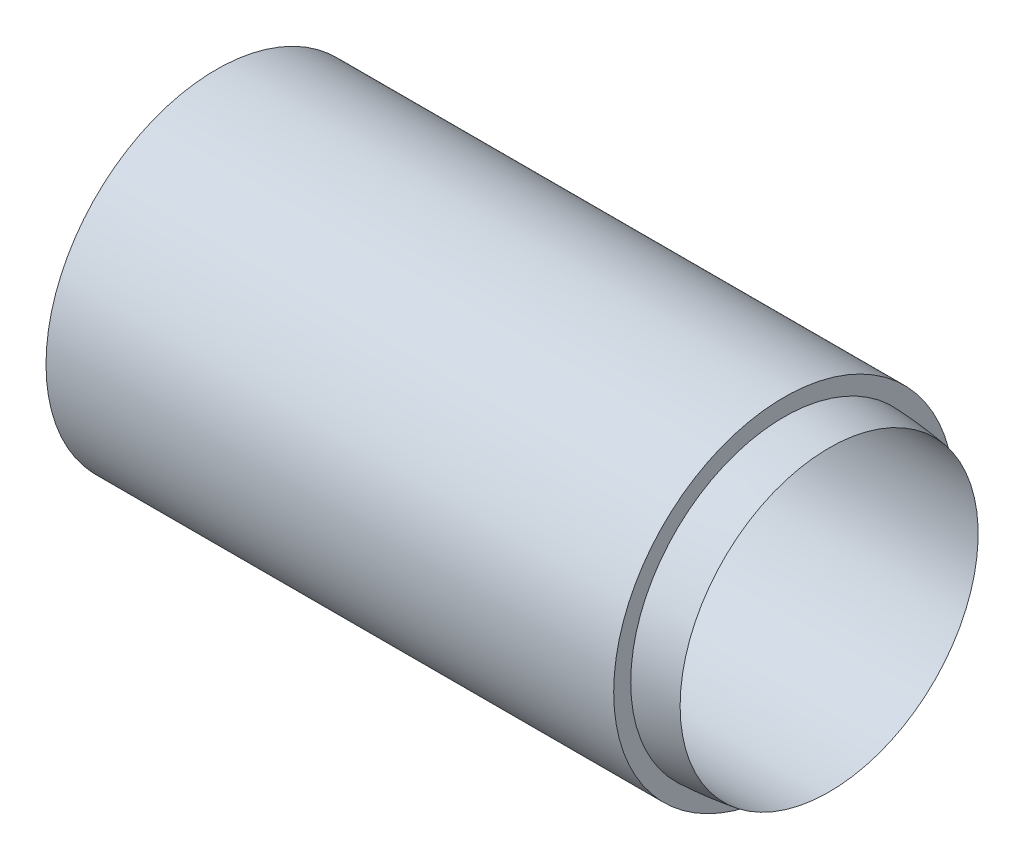
ISO-10303-21;
HEADER;
FILE_DESCRIPTION(('STEP AP214'),'2;1');
FILE_NAME('part.step','',(''),(''),'','','');
FILE_SCHEMA(('AUTOMOTIVE_DESIGN { 1 0 10303 214 1 1 1 1 }'));
ENDSEC;
DATA;
#1=APPLICATION_CONTEXT('core data for automotive mechanical design processes');
#2=APPLICATION_PROTOCOL_DEFINITION('international standard','automotive_design',2000,#1);
#3=PRODUCT_CONTEXT('',#1,'mechanical');
#4=PRODUCT('Part','Part','',(#3));
#5=PRODUCT_RELATED_PRODUCT_CATEGORY('part','',(#4));
#6=PRODUCT_DEFINITION_FORMATION('','',#4);
#7=PRODUCT_DEFINITION_CONTEXT('part definition',#1,'design');
#8=PRODUCT_DEFINITION('design','',#6,#7);
#9=PRODUCT_DEFINITION_SHAPE('','',#8);
#10=(LENGTH_UNIT() NAMED_UNIT(*) SI_UNIT(.MILLI.,.METRE.));
#11=(NAMED_UNIT(*) PLANE_ANGLE_UNIT() SI_UNIT($,.RADIAN.));
#12=(NAMED_UNIT(*) SI_UNIT($,.STERADIAN.) SOLID_ANGLE_UNIT());
#13=UNCERTAINTY_MEASURE_WITH_UNIT(LENGTH_MEASURE(1.E-05),#10,'distance_accuracy_value','');
#14=(GEOMETRIC_REPRESENTATION_CONTEXT(3) GLOBAL_UNCERTAINTY_ASSIGNED_CONTEXT((#13)) GLOBAL_UNIT_ASSIGNED_CONTEXT((#10,
#11,#12)) REPRESENTATION_CONTEXT('',''));
#15=CARTESIAN_POINT('',(0.,0.,0.));
#16=DIRECTION('',(0.,0.,1.));
#17=DIRECTION('',(1.,0.,0.));
#18=AXIS2_PLACEMENT_3D('',#15,#16,#17);
#19=CARTESIAN_POINT('',(25.1733286937252,-133.892343344048,-13.7741932185236));
#20=CARTESIAN_POINT('',(36.1556315212672,-134.407094184639,-13.7741932185236));
#21=CARTESIAN_POINT('',(51.3198315875487,-136.885981945863,-13.7741932185236));
#22=CARTESIAN_POINT('',(55.4574957653444,-149.492495977234,-13.7741932185236));
#23=B_SPLINE_CURVE_WITH_KNOTS('',3,(#19,#20,#21,#22),.UNSPECIFIED.,.F.,.F.,(4,4),(0.,1.),.UNSPECIFIED.);
#24=CARTESIAN_POINT('',(25.1733286937252,-160.892343344048,-13.7741932185236));
#25=DIRECTION('',(-1.,0.,0.));
#26=AXIS1_PLACEMENT('',#24,#25);
#27=SURFACE_OF_REVOLUTION('',#23,#26);
#28=CARTESIAN_POINT('',(33.123071464754,-160.892343344048,-13.7741932185236));
#29=DIRECTION('',(-1.,0.,0.));
#30=DIRECTION('',(0.,0.,1.));
#31=AXIS2_PLACEMENT_3D('',#28,#29,#30);
#32=CIRCLE('',#31,26.25);
#33=CARTESIAN_POINT('',(33.123071464754,-160.892343344048,12.4758067814764));
#34=VERTEX_POINT('',#33);
#35=EDGE_CURVE('E36',#34,#34,#32,.F.);
#36=ORIENTED_EDGE('',*,*,#35,.F.);
#37=EDGE_LOOP('',(#36));
#38=FACE_BOUND('',#37,.T.);
#39=CARTESIAN_POINT('',(25.1733286937252,-160.892343344048,-13.7741932185236));
#40=DIRECTION('',(-1.,0.,0.));
#41=DIRECTION('',(0.,0.,1.));
#42=AXIS2_PLACEMENT_3D('',#39,#40,#41);
#43=CIRCLE('',#42,27.);
#44=CARTESIAN_POINT('',(25.1733286937252,-160.892343344048,13.2258067814764));
#45=VERTEX_POINT('',#44);
#46=EDGE_CURVE('E10',#45,#45,#43,.T.);
#47=ORIENTED_EDGE('',*,*,#46,.F.);
#48=EDGE_LOOP('',(#47));
#49=FACE_BOUND('',#48,.T.);
#50=ADVANCED_FACE('F32',(#38,#49),#27,.F.);
#51=CARTESIAN_POINT('',(25.1733286937252,-130.892343344048,-13.7741932185236));
#52=DIRECTION('',(1.,0.,0.));
#53=DIRECTION('',(0.,0.,-1.));
#54=AXIS2_PLACEMENT_3D('',#51,#52,#53);
#55=PLANE('',#54);
#56=ORIENTED_EDGE('',*,*,#46,.T.);
#57=EDGE_LOOP('',(#56));
#58=FACE_BOUND('',#57,.T.);
#59=CARTESIAN_POINT('',(25.1733286937252,-160.892343344048,-13.7741932185236));
#60=DIRECTION('',(-1.,0.,0.));
#61=DIRECTION('',(0.,0.,1.));
#62=AXIS2_PLACEMENT_3D('',#59,#60,#61);
#63=CIRCLE('',#62,30.);
#64=CARTESIAN_POINT('',(25.1733286937252,-160.892343344048,16.2258067814764));
#65=VERTEX_POINT('',#64);
#66=EDGE_CURVE('E44',#65,#65,#63,.T.);
#67=ORIENTED_EDGE('',*,*,#66,.F.);
#68=EDGE_LOOP('',(#67));
#69=FACE_BOUND('',#68,.T.);
#70=ADVANCED_FACE('F58',(#58,#69),#55,.T.);
#71=CARTESIAN_POINT('',(134.828038819904,-160.892343344048,-13.7741932185236));
#72=DIRECTION('',(-1.,0.,0.));
#73=DIRECTION('',(0.,0.,1.));
#74=AXIS2_PLACEMENT_3D('',#71,#72,#73);
#75=CYLINDRICAL_SURFACE('',#74,26.25);
#76=CARTESIAN_POINT('',(-74.8266713062748,-160.892343344048,-13.7741932185236));
#77=DIRECTION('',(1.,0.,0.));
#78=DIRECTION('',(0.,0.,-1.));
#79=AXIS2_PLACEMENT_3D('',#76,#77,#78);
#80=CIRCLE('',#79,26.25);
#81=CARTESIAN_POINT('',(-74.8266713062748,-160.892343344048,-40.0241932185236));
#82=VERTEX_POINT('',#81);
#83=EDGE_CURVE('E48',#82,#82,#80,.T.);
#84=ORIENTED_EDGE('',*,*,#83,.F.);
#85=EDGE_LOOP('',(#84));
#86=FACE_BOUND('',#85,.T.);
#87=ORIENTED_EDGE('',*,*,#35,.T.);
#88=EDGE_LOOP('',(#87));
#89=FACE_BOUND('',#88,.T.);
#90=ADVANCED_FACE('F60',(#86,#89),#75,.F.);
#91=CARTESIAN_POINT('',(134.828038819904,-160.892343344048,-13.7741932185236));
#92=DIRECTION('',(-1.,0.,0.));
#93=DIRECTION('',(0.,0.,1.));
#94=AXIS2_PLACEMENT_3D('',#91,#92,#93);
#95=CYLINDRICAL_SURFACE('',#94,30.);
#96=CARTESIAN_POINT('',(-74.8266713062748,-160.892343344048,-13.7741932185236));
#97=DIRECTION('',(1.,0.,0.));
#98=DIRECTION('',(0.,0.,-1.));
#99=AXIS2_PLACEMENT_3D('',#96,#97,#98);
#100=CIRCLE('',#99,30.);
#101=CARTESIAN_POINT('',(-74.8266713062748,-160.892343344048,-43.7741932185236));
#102=VERTEX_POINT('',#101);
#103=EDGE_CURVE('E50',#102,#102,#100,.T.);
#104=ORIENTED_EDGE('',*,*,#103,.T.);
#105=EDGE_LOOP('',(#104));
#106=FACE_BOUND('',#105,.T.);
#107=ORIENTED_EDGE('',*,*,#66,.T.);
#108=EDGE_LOOP('',(#107));
#109=FACE_BOUND('',#108,.T.);
#110=ADVANCED_FACE('F34',(#106,#109),#95,.T.);
#111=CARTESIAN_POINT('',(-74.8266713062748,-160.892343344048,-13.7741932185236));
#112=DIRECTION('',(1.,0.,0.));
#113=DIRECTION('',(0.,0.,-1.));
#114=AXIS2_PLACEMENT_3D('',#111,#112,#113);
#115=PLANE('',#114);
#116=ORIENTED_EDGE('',*,*,#103,.F.);
#117=EDGE_LOOP('',(#116));
#118=FACE_BOUND('',#117,.T.);
#119=ORIENTED_EDGE('',*,*,#83,.T.);
#120=EDGE_LOOP('',(#119));
#121=FACE_BOUND('',#120,.T.);
#122=ADVANCED_FACE('F76',(#118,#121),#115,.F.);
#123=CLOSED_SHELL('',(#50,#70,#90,#110,#122));
#124=MANIFOLD_SOLID_BREP('B2',#123);
#125=ADVANCED_BREP_SHAPE_REPRESENTATION('',(#18,#124),#14);
#126=SHAPE_DEFINITION_REPRESENTATION(#9,#125);
ENDSEC;
END-ISO-10303-21;
